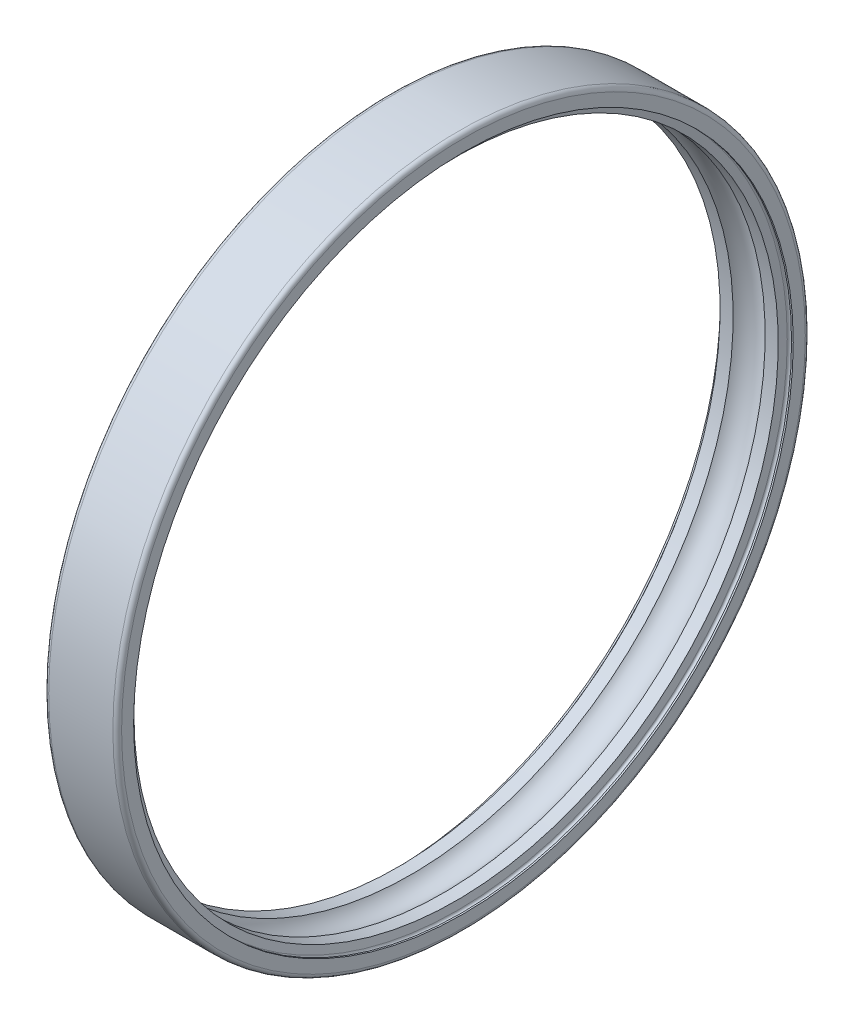
ISO-10303-21;
HEADER;
FILE_DESCRIPTION(('STEP AP214'),'2;1');
FILE_NAME('part.step','',(''),(''),'','','');
FILE_SCHEMA(('AUTOMOTIVE_DESIGN { 1 0 10303 214 1 1 1 1 }'));
ENDSEC;
DATA;
#1=APPLICATION_CONTEXT('core data for automotive mechanical design processes');
#2=APPLICATION_PROTOCOL_DEFINITION('international standard','automotive_design',2000,#1);
#3=PRODUCT_CONTEXT('',#1,'mechanical');
#4=PRODUCT('Part','Part','',(#3));
#5=PRODUCT_RELATED_PRODUCT_CATEGORY('part','',(#4));
#6=PRODUCT_DEFINITION_FORMATION('','',#4);
#7=PRODUCT_DEFINITION_CONTEXT('part definition',#1,'design');
#8=PRODUCT_DEFINITION('design','',#6,#7);
#9=PRODUCT_DEFINITION_SHAPE('','',#8);
#10=(LENGTH_UNIT() NAMED_UNIT(*) SI_UNIT(.MILLI.,.METRE.));
#11=(NAMED_UNIT(*) PLANE_ANGLE_UNIT() SI_UNIT($,.RADIAN.));
#12=(NAMED_UNIT(*) SI_UNIT($,.STERADIAN.) SOLID_ANGLE_UNIT());
#13=UNCERTAINTY_MEASURE_WITH_UNIT(LENGTH_MEASURE(1.E-05),#10,'distance_accuracy_value','');
#14=(GEOMETRIC_REPRESENTATION_CONTEXT(3) GLOBAL_UNCERTAINTY_ASSIGNED_CONTEXT((#13)) GLOBAL_UNIT_ASSIGNED_CONTEXT((#10,
#11,#12)) REPRESENTATION_CONTEXT('',''));
#15=CARTESIAN_POINT('',(0.,0.,0.));
#16=DIRECTION('',(0.,0.,1.));
#17=DIRECTION('',(1.,0.,0.));
#18=AXIS2_PLACEMENT_3D('',#15,#16,#17);
#19=CARTESIAN_POINT('',(0.599999999999878,0.,0.));
#20=DIRECTION('',(-1.,0.,0.));
#21=DIRECTION('',(0.,0.,1.));
#22=AXIS2_PLACEMENT_3D('',#19,#20,#21);
#23=TOROIDAL_SURFACE('',#22,46.9000000000001,0.599999999999878);
#24=CARTESIAN_POINT('',(0.,0.,0.));
#25=DIRECTION('',(-1.,0.,0.));
#26=DIRECTION('',(0.,0.,1.));
#27=AXIS2_PLACEMENT_3D('',#24,#25,#26);
#28=CIRCLE('',#27,46.9);
#29=CARTESIAN_POINT('',(0.,0.,46.9));
#30=VERTEX_POINT('',#29);
#31=EDGE_CURVE('E10',#30,#30,#28,.T.);
#32=ORIENTED_EDGE('',*,*,#31,.F.);
#33=EDGE_LOOP('',(#32));
#34=FACE_BOUND('',#33,.T.);
#35=CARTESIAN_POINT('',(0.6,0.,0.));
#36=DIRECTION('',(-1.,0.,0.));
#37=DIRECTION('',(0.,0.,1.));
#38=AXIS2_PLACEMENT_3D('',#35,#36,#37);
#39=CIRCLE('',#38,47.5);
#40=CARTESIAN_POINT('',(0.6,0.,47.5));
#41=VERTEX_POINT('',#40);
#42=EDGE_CURVE('E60',#41,#41,#39,.T.);
#43=ORIENTED_EDGE('',*,*,#42,.T.);
#44=EDGE_LOOP('',(#43));
#45=FACE_BOUND('',#44,.T.);
#46=ADVANCED_FACE('F14',(#34,#45),#23,.T.);
#47=CARTESIAN_POINT('',(0.,46.9,0.));
#48=DIRECTION('',(1.,0.,0.));
#49=DIRECTION('',(0.,0.,-1.));
#50=AXIS2_PLACEMENT_3D('',#47,#48,#49);
#51=PLANE('',#50);
#52=CARTESIAN_POINT('',(0.,0.,0.));
#53=DIRECTION('',(-1.,0.,0.));
#54=DIRECTION('',(0.,0.,1.));
#55=AXIS2_PLACEMENT_3D('',#52,#53,#54);
#56=CIRCLE('',#55,45.25);
#57=CARTESIAN_POINT('',(0.,0.,45.25));
#58=VERTEX_POINT('',#57);
#59=EDGE_CURVE('E20',#58,#58,#56,.T.);
#60=ORIENTED_EDGE('',*,*,#59,.F.);
#61=EDGE_LOOP('',(#60));
#62=FACE_BOUND('',#61,.T.);
#63=ORIENTED_EDGE('',*,*,#31,.T.);
#64=EDGE_LOOP('',(#63));
#65=FACE_BOUND('',#64,.T.);
#66=ADVANCED_FACE('F133',(#62,#65),#51,.F.);
#67=CARTESIAN_POINT('',(9.4,0.,0.));
#68=DIRECTION('',(-1.,0.,0.));
#69=DIRECTION('',(0.,0.,1.));
#70=AXIS2_PLACEMENT_3D('',#67,#68,#69);
#71=CYLINDRICAL_SURFACE('',#70,45.25);
#72=CARTESIAN_POINT('',(0.23022222222222,0.,0.));
#73=DIRECTION('',(-1.,0.,0.));
#74=DIRECTION('',(0.,0.,1.));
#75=AXIS2_PLACEMENT_3D('',#72,#73,#74);
#76=CIRCLE('',#75,45.25);
#77=CARTESIAN_POINT('',(0.23022222222222,0.,45.25));
#78=VERTEX_POINT('',#77);
#79=EDGE_CURVE('E24',#78,#78,#76,.T.);
#80=ORIENTED_EDGE('',*,*,#79,.F.);
#81=EDGE_LOOP('',(#80));
#82=FACE_BOUND('',#81,.T.);
#83=ORIENTED_EDGE('',*,*,#59,.T.);
#84=EDGE_LOOP('',(#83));
#85=FACE_BOUND('',#84,.T.);
#86=ADVANCED_FACE('F128',(#82,#85),#71,.F.);
#87=CARTESIAN_POINT('',(0.52622222222222,0.,0.));
#88=DIRECTION('',(-1.,0.,0.));
#89=DIRECTION('',(0.,0.,1.));
#90=AXIS2_PLACEMENT_3D('',#87,#88,#89);
#91=TOROIDAL_SURFACE('',#90,45.25,0.296);
#92=CARTESIAN_POINT('',(0.822222222222219,0.,0.));
#93=DIRECTION('',(-1.,0.,0.));
#94=DIRECTION('',(0.,0.,1.));
#95=AXIS2_PLACEMENT_3D('',#92,#93,#94);
#96=CIRCLE('',#95,45.25);
#97=CARTESIAN_POINT('',(0.822222222222219,0.,45.25));
#98=VERTEX_POINT('',#97);
#99=EDGE_CURVE('E28',#98,#98,#96,.T.);
#100=ORIENTED_EDGE('',*,*,#99,.F.);
#101=EDGE_LOOP('',(#100));
#102=FACE_BOUND('',#101,.T.);
#103=ORIENTED_EDGE('',*,*,#79,.T.);
#104=EDGE_LOOP('',(#103));
#105=FACE_BOUND('',#104,.T.);
#106=ADVANCED_FACE('F122',(#102,#105),#91,.F.);
#107=CARTESIAN_POINT('',(0.822222222222219,0.,0.));
#108=DIRECTION('',(-1.,0.,0.));
#109=DIRECTION('',(0.,0.,1.));
#110=AXIS2_PLACEMENT_3D('',#107,#108,#109);
#111=CONICAL_SURFACE('',#110,45.25,1.39626340159547);
#112=CARTESIAN_POINT('',(1.0073655519661,0.,0.));
#113=DIRECTION('',(-1.,0.,0.));
#114=DIRECTION('',(0.,0.,1.));
#115=AXIS2_PLACEMENT_3D('',#112,#113,#114);
#116=CIRCLE('',#115,44.2);
#117=CARTESIAN_POINT('',(1.0073655519661,0.,44.2));
#118=VERTEX_POINT('',#117);
#119=EDGE_CURVE('E33',#118,#118,#116,.T.);
#120=ORIENTED_EDGE('',*,*,#119,.F.);
#121=EDGE_LOOP('',(#120));
#122=FACE_BOUND('',#121,.T.);
#123=ORIENTED_EDGE('',*,*,#99,.T.);
#124=EDGE_LOOP('',(#123));
#125=FACE_BOUND('',#124,.T.);
#126=ADVANCED_FACE('F116',(#122,#125),#111,.F.);
#127=CARTESIAN_POINT('',(9.4,0.,0.));
#128=DIRECTION('',(-1.,0.,0.));
#129=DIRECTION('',(0.,0.,1.));
#130=AXIS2_PLACEMENT_3D('',#127,#128,#129);
#131=CYLINDRICAL_SURFACE('',#130,44.2);
#132=CARTESIAN_POINT('',(2.8028919007022,0.,0.));
#133=DIRECTION('',(-1.,0.,0.));
#134=DIRECTION('',(0.,0.,1.));
#135=AXIS2_PLACEMENT_3D('',#132,#133,#134);
#136=CIRCLE('',#135,44.2);
#137=CARTESIAN_POINT('',(2.8028919007022,0.,44.2));
#138=VERTEX_POINT('',#137);
#139=EDGE_CURVE('E36',#138,#138,#136,.T.);
#140=ORIENTED_EDGE('',*,*,#139,.F.);
#141=EDGE_LOOP('',(#140));
#142=FACE_BOUND('',#141,.T.);
#143=ORIENTED_EDGE('',*,*,#119,.T.);
#144=EDGE_LOOP('',(#143));
#145=FACE_BOUND('',#144,.T.);
#146=ADVANCED_FACE('F110',(#142,#145),#131,.F.);
#147=CARTESIAN_POINT('',(5.,0.,0.));
#148=DIRECTION('',(-1.,0.,0.));
#149=DIRECTION('',(0.,0.,1.));
#150=AXIS2_PLACEMENT_3D('',#147,#148,#149);
#151=TOROIDAL_SURFACE('',#150,42.5,2.778);
#152=CARTESIAN_POINT('',(7.1971080992978,0.,0.));
#153=DIRECTION('',(-1.,0.,0.));
#154=DIRECTION('',(0.,0.,1.));
#155=AXIS2_PLACEMENT_3D('',#152,#153,#154);
#156=CIRCLE('',#155,44.2);
#157=CARTESIAN_POINT('',(7.1971080992978,0.,44.2));
#158=VERTEX_POINT('',#157);
#159=EDGE_CURVE('E39',#158,#158,#156,.T.);
#160=ORIENTED_EDGE('',*,*,#159,.F.);
#161=EDGE_LOOP('',(#160));
#162=FACE_BOUND('',#161,.T.);
#163=ORIENTED_EDGE('',*,*,#139,.T.);
#164=EDGE_LOOP('',(#163));
#165=FACE_BOUND('',#164,.T.);
#166=ADVANCED_FACE('F104',(#162,#165),#151,.F.);
#167=CARTESIAN_POINT('',(9.4,0.,0.));
#168=DIRECTION('',(-1.,0.,0.));
#169=DIRECTION('',(0.,0.,1.));
#170=AXIS2_PLACEMENT_3D('',#167,#168,#169);
#171=CYLINDRICAL_SURFACE('',#170,44.2);
#172=CARTESIAN_POINT('',(8.9926344480339,0.,0.));
#173=DIRECTION('',(-1.,0.,0.));
#174=DIRECTION('',(0.,0.,1.));
#175=AXIS2_PLACEMENT_3D('',#172,#173,#174);
#176=CIRCLE('',#175,44.2);
#177=CARTESIAN_POINT('',(8.9926344480339,0.,44.2));
#178=VERTEX_POINT('',#177);
#179=EDGE_CURVE('E42',#178,#178,#176,.T.);
#180=ORIENTED_EDGE('',*,*,#179,.F.);
#181=EDGE_LOOP('',(#180));
#182=FACE_BOUND('',#181,.T.);
#183=ORIENTED_EDGE('',*,*,#159,.T.);
#184=EDGE_LOOP('',(#183));
#185=FACE_BOUND('',#184,.T.);
#186=ADVANCED_FACE('F98',(#182,#185),#171,.F.);
#187=CARTESIAN_POINT('',(8.9926344480339,0.,0.));
#188=DIRECTION('',(1.,0.,0.));
#189=DIRECTION('',(0.,0.,-1.));
#190=AXIS2_PLACEMENT_3D('',#187,#188,#189);
#191=CONICAL_SURFACE('',#190,44.2,1.39626340159545);
#192=CARTESIAN_POINT('',(9.1777777777778,0.,0.));
#193=DIRECTION('',(-1.,0.,0.));
#194=DIRECTION('',(0.,0.,1.));
#195=AXIS2_PLACEMENT_3D('',#192,#193,#194);
#196=CIRCLE('',#195,45.25);
#197=CARTESIAN_POINT('',(9.1777777777778,0.,45.25));
#198=VERTEX_POINT('',#197);
#199=EDGE_CURVE('E45',#198,#198,#196,.T.);
#200=ORIENTED_EDGE('',*,*,#199,.F.);
#201=EDGE_LOOP('',(#200));
#202=FACE_BOUND('',#201,.T.);
#203=ORIENTED_EDGE('',*,*,#179,.T.);
#204=EDGE_LOOP('',(#203));
#205=FACE_BOUND('',#204,.T.);
#206=ADVANCED_FACE('F92',(#202,#205),#191,.F.);
#207=CARTESIAN_POINT('',(9.4737777777778,0.,0.));
#208=DIRECTION('',(-1.,0.,0.));
#209=DIRECTION('',(0.,0.,1.));
#210=AXIS2_PLACEMENT_3D('',#207,#208,#209);
#211=TOROIDAL_SURFACE('',#210,45.25,0.296);
#212=CARTESIAN_POINT('',(9.7697777777778,0.,0.));
#213=DIRECTION('',(-1.,0.,0.));
#214=DIRECTION('',(0.,0.,1.));
#215=AXIS2_PLACEMENT_3D('',#212,#213,#214);
#216=CIRCLE('',#215,45.25);
#217=CARTESIAN_POINT('',(9.7697777777778,0.,45.25));
#218=VERTEX_POINT('',#217);
#219=EDGE_CURVE('E48',#218,#218,#216,.T.);
#220=ORIENTED_EDGE('',*,*,#219,.F.);
#221=EDGE_LOOP('',(#220));
#222=FACE_BOUND('',#221,.T.);
#223=ORIENTED_EDGE('',*,*,#199,.T.);
#224=EDGE_LOOP('',(#223));
#225=FACE_BOUND('',#224,.T.);
#226=ADVANCED_FACE('F86',(#222,#225),#211,.F.);
#227=CARTESIAN_POINT('',(9.4,0.,0.));
#228=DIRECTION('',(-1.,0.,0.));
#229=DIRECTION('',(0.,0.,1.));
#230=AXIS2_PLACEMENT_3D('',#227,#228,#229);
#231=CYLINDRICAL_SURFACE('',#230,45.25);
#232=CARTESIAN_POINT('',(10.,0.,0.));
#233=DIRECTION('',(-1.,0.,0.));
#234=DIRECTION('',(0.,0.,1.));
#235=AXIS2_PLACEMENT_3D('',#232,#233,#234);
#236=CIRCLE('',#235,45.25);
#237=CARTESIAN_POINT('',(10.,0.,45.25));
#238=VERTEX_POINT('',#237);
#239=EDGE_CURVE('E51',#238,#238,#236,.T.);
#240=ORIENTED_EDGE('',*,*,#239,.F.);
#241=EDGE_LOOP('',(#240));
#242=FACE_BOUND('',#241,.T.);
#243=ORIENTED_EDGE('',*,*,#219,.T.);
#244=EDGE_LOOP('',(#243));
#245=FACE_BOUND('',#244,.T.);
#246=ADVANCED_FACE('F80',(#242,#245),#231,.F.);
#247=CARTESIAN_POINT('',(10.,45.25,0.));
#248=DIRECTION('',(-1.,0.,0.));
#249=DIRECTION('',(0.,0.,1.));
#250=AXIS2_PLACEMENT_3D('',#247,#248,#249);
#251=PLANE('',#250);
#252=CARTESIAN_POINT('',(10.,0.,0.));
#253=DIRECTION('',(-1.,0.,0.));
#254=DIRECTION('',(0.,0.,1.));
#255=AXIS2_PLACEMENT_3D('',#252,#253,#254);
#256=CIRCLE('',#255,46.9);
#257=CARTESIAN_POINT('',(10.,0.,46.9));
#258=VERTEX_POINT('',#257);
#259=EDGE_CURVE('E54',#258,#258,#256,.T.);
#260=ORIENTED_EDGE('',*,*,#259,.F.);
#261=EDGE_LOOP('',(#260));
#262=FACE_BOUND('',#261,.T.);
#263=ORIENTED_EDGE('',*,*,#239,.T.);
#264=EDGE_LOOP('',(#263));
#265=FACE_BOUND('',#264,.T.);
#266=ADVANCED_FACE('F74',(#262,#265),#251,.F.);
#267=CARTESIAN_POINT('',(9.40000000000007,0.,0.));
#268=DIRECTION('',(-1.,0.,0.));
#269=DIRECTION('',(0.,0.,1.));
#270=AXIS2_PLACEMENT_3D('',#267,#268,#269);
#271=TOROIDAL_SURFACE('',#270,46.9000000000001,0.599999999999928);
#272=CARTESIAN_POINT('',(9.4,0.,0.));
#273=DIRECTION('',(-1.,0.,0.));
#274=DIRECTION('',(0.,0.,1.));
#275=AXIS2_PLACEMENT_3D('',#272,#273,#274);
#276=CIRCLE('',#275,47.5);
#277=CARTESIAN_POINT('',(9.4,0.,47.5));
#278=VERTEX_POINT('',#277);
#279=EDGE_CURVE('E57',#278,#278,#276,.T.);
#280=ORIENTED_EDGE('',*,*,#279,.F.);
#281=EDGE_LOOP('',(#280));
#282=FACE_BOUND('',#281,.T.);
#283=ORIENTED_EDGE('',*,*,#259,.T.);
#284=EDGE_LOOP('',(#283));
#285=FACE_BOUND('',#284,.T.);
#286=ADVANCED_FACE('F68',(#282,#285),#271,.T.);
#287=CARTESIAN_POINT('',(9.4,0.,0.));
#288=DIRECTION('',(-1.,0.,0.));
#289=DIRECTION('',(0.,0.,1.));
#290=AXIS2_PLACEMENT_3D('',#287,#288,#289);
#291=CYLINDRICAL_SURFACE('',#290,47.5);
#292=ORIENTED_EDGE('',*,*,#42,.F.);
#293=EDGE_LOOP('',(#292));
#294=FACE_BOUND('',#293,.T.);
#295=ORIENTED_EDGE('',*,*,#279,.T.);
#296=EDGE_LOOP('',(#295));
#297=FACE_BOUND('',#296,.T.);
#298=ADVANCED_FACE('F65',(#294,#297),#291,.T.);
#299=CLOSED_SHELL('',(#46,#66,#86,#106,#126,#146,#166,#186,#206,#226,#246,#266,#286,#298));
#300=MANIFOLD_SOLID_BREP('B1',#299);
#301=ADVANCED_BREP_SHAPE_REPRESENTATION('',(#18,#300),#14);
#302=SHAPE_DEFINITION_REPRESENTATION(#9,#301);
ENDSEC;
END-ISO-10303-21;
